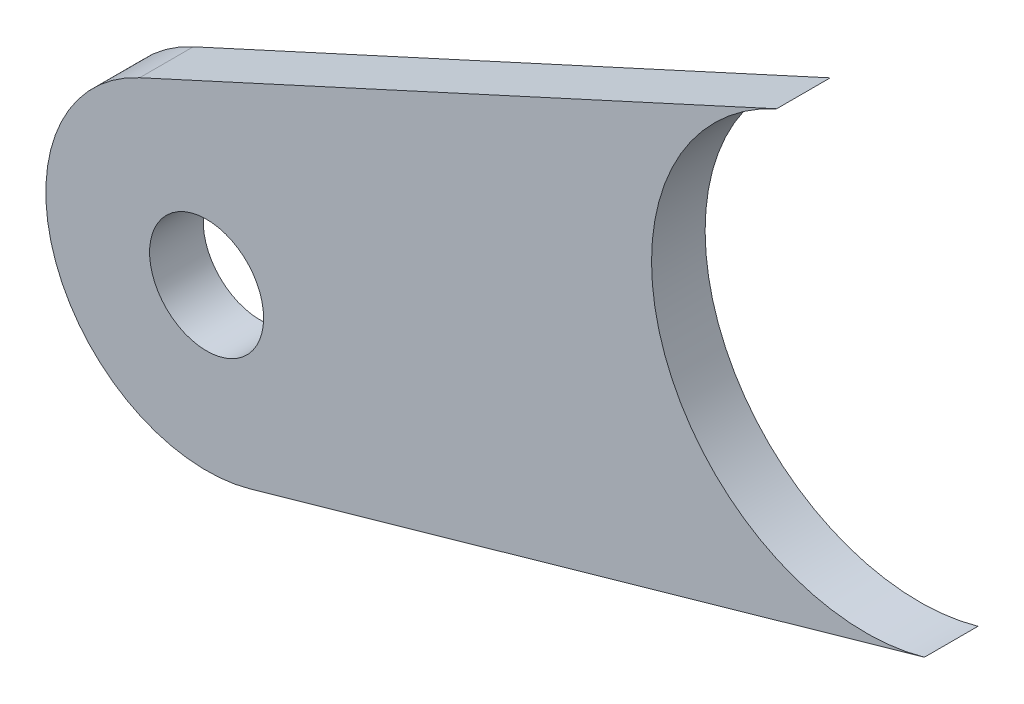
ISO-10303-21;
HEADER;
FILE_DESCRIPTION(('STEP AP214'),'2;1');
FILE_NAME('part.step','',(''),(''),'','','');
FILE_SCHEMA(('AUTOMOTIVE_DESIGN { 1 0 10303 214 1 1 1 1 }'));
ENDSEC;
DATA;
#1=APPLICATION_CONTEXT('core data for automotive mechanical design processes');
#2=APPLICATION_PROTOCOL_DEFINITION('international standard','automotive_design',2000,#1);
#3=PRODUCT_CONTEXT('',#1,'mechanical');
#4=PRODUCT('Part','Part','',(#3));
#5=PRODUCT_RELATED_PRODUCT_CATEGORY('part','',(#4));
#6=PRODUCT_DEFINITION_FORMATION('','',#4);
#7=PRODUCT_DEFINITION_CONTEXT('part definition',#1,'design');
#8=PRODUCT_DEFINITION('design','',#6,#7);
#9=PRODUCT_DEFINITION_SHAPE('','',#8);
#10=(LENGTH_UNIT() NAMED_UNIT(*) SI_UNIT(.MILLI.,.METRE.));
#11=(NAMED_UNIT(*) PLANE_ANGLE_UNIT() SI_UNIT($,.RADIAN.));
#12=(NAMED_UNIT(*) SI_UNIT($,.STERADIAN.) SOLID_ANGLE_UNIT());
#13=UNCERTAINTY_MEASURE_WITH_UNIT(LENGTH_MEASURE(1.E-05),#10,'distance_accuracy_value','');
#14=(GEOMETRIC_REPRESENTATION_CONTEXT(3) GLOBAL_UNCERTAINTY_ASSIGNED_CONTEXT((#13)) GLOBAL_UNIT_ASSIGNED_CONTEXT((#10,
#11,#12)) REPRESENTATION_CONTEXT('',''));
#15=CARTESIAN_POINT('',(0.,0.,0.));
#16=DIRECTION('',(0.,0.,1.));
#17=DIRECTION('',(1.,0.,0.));
#18=AXIS2_PLACEMENT_3D('',#15,#16,#17);
#19=CARTESIAN_POINT('',(13.6307809818761,-29.7770692260945,3.175));
#20=DIRECTION('',(-0.416224605095547,0.909261831439688,0.));
#21=DIRECTION('',(-0.909261831439688,-0.416224605095547,0.));
#22=AXIS2_PLACEMENT_3D('',#19,#20,#21);
#23=PLANE('',#22);
#24=DIRECTION('',(0.909261831439689,0.416224605095547,0.));
#25=VECTOR('',#24,1.);
#26=CARTESIAN_POINT('',(13.6307809818761,-29.7770692260945,0.));
#27=LINE('',#26,#25);
#28=CARTESIAN_POINT('',(97.5999006364649,8.66071894446303,0.));
#29=VERTEX_POINT('',#28);
#30=CARTESIAN_POINT('',(135.340894537363,25.9370740482972,0.));
#31=VERTEX_POINT('',#30);
#32=EDGE_CURVE('E108',#29,#31,#27,.T.);
#33=ORIENTED_EDGE('',*,*,#32,.F.);
#34=DIRECTION('',(0.,0.,-1.));
#35=VECTOR('',#34,1.);
#36=CARTESIAN_POINT('',(97.5999006364649,8.66071894446303,3.175));
#37=LINE('',#36,#35);
#38=CARTESIAN_POINT('',(97.5999006364649,8.66071894446303,3.175));
#39=VERTEX_POINT('',#38);
#40=EDGE_CURVE('E11',#39,#29,#37,.T.);
#41=ORIENTED_EDGE('',*,*,#40,.F.);
#42=DIRECTION('',(0.909261831439689,0.416224605095547,0.));
#43=VECTOR('',#42,1.);
#44=CARTESIAN_POINT('',(13.6307809818761,-29.7770692260945,3.175));
#45=LINE('',#44,#43);
#46=CARTESIAN_POINT('',(135.340894537363,25.9370740482972,3.175));
#47=VERTEX_POINT('',#46);
#48=EDGE_CURVE('E90',#39,#47,#45,.T.);
#49=ORIENTED_EDGE('',*,*,#48,.T.);
#50=DIRECTION('',(0.,0.,-1.));
#51=VECTOR('',#50,1.);
#52=CARTESIAN_POINT('',(135.340894537363,25.9370740482972,3.175));
#53=LINE('',#52,#51);
#54=EDGE_CURVE('E57',#47,#31,#53,.T.);
#55=ORIENTED_EDGE('',*,*,#54,.T.);
#56=EDGE_LOOP('',(#33,#41,#49,#55));
#57=FACE_BOUND('',#56,.T.);
#58=ADVANCED_FACE('F41',(#57),#23,.T.);
#59=CARTESIAN_POINT('',(101.56444,0.,3.175));
#60=DIRECTION('',(0.,0.,-1.));
#61=DIRECTION('',(-1.,0.,0.));
#62=AXIS2_PLACEMENT_3D('',#59,#60,#61);
#63=CYLINDRICAL_SURFACE('',#62,9.52500000000001);
#64=CARTESIAN_POINT('',(101.56444,0.,0.));
#65=DIRECTION('',(0.,0.,1.));
#66=DIRECTION('',(1.,0.,0.));
#67=AXIS2_PLACEMENT_3D('',#64,#65,#66);
#68=CIRCLE('',#67,9.52500000000001);
#69=CARTESIAN_POINT('',(104.16560106799,-9.16294636557346,0.));
#70=VERTEX_POINT('',#69);
#71=EDGE_CURVE('E96',#29,#70,#68,.T.);
#72=ORIENTED_EDGE('',*,*,#71,.T.);
#73=DIRECTION('',(0.,0.,-1.));
#74=VECTOR('',#73,1.);
#75=CARTESIAN_POINT('',(104.16560106799,-9.16294636557346,3.175));
#76=LINE('',#75,#74);
#77=CARTESIAN_POINT('',(104.16560106799,-9.16294636557346,3.175));
#78=VERTEX_POINT('',#77);
#79=EDGE_CURVE('E49',#78,#70,#76,.T.);
#80=ORIENTED_EDGE('',*,*,#79,.F.);
#81=CARTESIAN_POINT('',(101.56444,0.,3.175));
#82=DIRECTION('',(0.,0.,1.));
#83=DIRECTION('',(1.,0.,0.));
#84=AXIS2_PLACEMENT_3D('',#81,#82,#83);
#85=CIRCLE('',#84,9.52500000000001);
#86=EDGE_CURVE('E83',#39,#78,#85,.T.);
#87=ORIENTED_EDGE('',*,*,#86,.F.);
#88=ORIENTED_EDGE('',*,*,#40,.T.);
#89=EDGE_LOOP('',(#72,#80,#87,#88));
#90=FACE_BOUND('',#89,.T.);
#91=ADVANCED_FACE('F94',(#90),#63,.T.);
#92=CARTESIAN_POINT('',(10.1755255549988,-35.8446833798106,3.175));
#93=DIRECTION('',(-0.273087776166883,0.961989119745242,0.));
#94=DIRECTION('',(-0.961989119745243,-0.273087776166883,0.));
#95=AXIS2_PLACEMENT_3D('',#92,#93,#94);
#96=PLANE('',#95);
#97=DIRECTION('',(0.961989119745242,0.273087776166883,0.));
#98=VECTOR('',#97,1.);
#99=CARTESIAN_POINT('',(10.1755255549988,-35.8446833798106,0.));
#100=LINE('',#99,#98);
#101=CARTESIAN_POINT('',(144.095161779396,2.17218696824859,0.));
#102=VERTEX_POINT('',#101);
#103=EDGE_CURVE('E111',#70,#102,#100,.T.);
#104=ORIENTED_EDGE('',*,*,#103,.T.);
#105=DIRECTION('',(0.,0.,-1.));
#106=VECTOR('',#105,1.);
#107=CARTESIAN_POINT('',(144.095161779396,2.17218696824859,3.175));
#108=LINE('',#107,#106);
#109=CARTESIAN_POINT('',(144.095161779396,2.17218696824859,3.175));
#110=VERTEX_POINT('',#109);
#111=EDGE_CURVE('E71',#110,#102,#108,.T.);
#112=ORIENTED_EDGE('',*,*,#111,.F.);
#113=DIRECTION('',(0.961989119745242,0.273087776166883,0.));
#114=VECTOR('',#113,1.);
#115=CARTESIAN_POINT('',(10.1755255549988,-35.8446833798106,3.175));
#116=LINE('',#115,#114);
#117=EDGE_CURVE('E89',#78,#110,#116,.T.);
#118=ORIENTED_EDGE('',*,*,#117,.F.);
#119=ORIENTED_EDGE('',*,*,#79,.T.);
#120=EDGE_LOOP('',(#104,#112,#118,#119));
#121=FACE_BOUND('',#120,.T.);
#122=ADVANCED_FACE('F99',(#121),#96,.F.);
#123=CARTESIAN_POINT('',(140.626947022076,14.3894487890132,3.175));
#124=DIRECTION('',(0.,0.,-1.));
#125=DIRECTION('',(-1.,0.,0.));
#126=AXIS2_PLACEMENT_3D('',#123,#124,#125);
#127=CYLINDRICAL_SURFACE('',#126,12.7);
#128=CARTESIAN_POINT('',(140.626947022076,14.3894487890132,0.));
#129=DIRECTION('',(0.,0.,1.));
#130=DIRECTION('',(1.,0.,0.));
#131=AXIS2_PLACEMENT_3D('',#128,#129,#130);
#132=CIRCLE('',#131,12.7);
#133=EDGE_CURVE('E113',#31,#102,#132,.T.);
#134=ORIENTED_EDGE('',*,*,#133,.F.);
#135=ORIENTED_EDGE('',*,*,#54,.F.);
#136=CARTESIAN_POINT('',(140.626947022076,14.3894487890132,3.175));
#137=DIRECTION('',(0.,0.,1.));
#138=DIRECTION('',(1.,0.,0.));
#139=AXIS2_PLACEMENT_3D('',#136,#137,#138);
#140=CIRCLE('',#139,12.7);
#141=EDGE_CURVE('E100',#47,#110,#140,.T.);
#142=ORIENTED_EDGE('',*,*,#141,.T.);
#143=ORIENTED_EDGE('',*,*,#111,.T.);
#144=EDGE_LOOP('',(#134,#135,#142,#143));
#145=FACE_BOUND('',#144,.T.);
#146=ADVANCED_FACE('F122',(#145),#127,.F.);
#147=CARTESIAN_POINT('',(101.56444,0.,3.175));
#148=DIRECTION('',(0.,0.,-1.));
#149=DIRECTION('',(-1.,0.,0.));
#150=AXIS2_PLACEMENT_3D('',#147,#148,#149);
#151=CYLINDRICAL_SURFACE('',#150,3.37819999999999);
#152=CARTESIAN_POINT('',(101.56444,0.,3.175));
#153=DIRECTION('',(0.,0.,1.));
#154=DIRECTION('',(1.,0.,0.));
#155=AXIS2_PLACEMENT_3D('',#152,#153,#154);
#156=CIRCLE('',#155,3.37819999999999);
#157=CARTESIAN_POINT('',(104.94264,0.,3.175));
#158=VERTEX_POINT('',#157);
#159=EDGE_CURVE('E102',#158,#158,#156,.F.);
#160=ORIENTED_EDGE('',*,*,#159,.F.);
#161=EDGE_LOOP('',(#160));
#162=FACE_BOUND('',#161,.T.);
#163=CARTESIAN_POINT('',(101.56444,0.,0.));
#164=DIRECTION('',(0.,0.,1.));
#165=DIRECTION('',(1.,0.,0.));
#166=AXIS2_PLACEMENT_3D('',#163,#164,#165);
#167=CIRCLE('',#166,3.37819999999999);
#168=CARTESIAN_POINT('',(104.94264,0.,0.));
#169=VERTEX_POINT('',#168);
#170=EDGE_CURVE('E116',#169,#169,#167,.F.);
#171=ORIENTED_EDGE('',*,*,#170,.T.);
#172=EDGE_LOOP('',(#171));
#173=FACE_BOUND('',#172,.T.);
#174=ADVANCED_FACE('F124',(#162,#173),#151,.F.);
#175=CARTESIAN_POINT('',(0.,0.,3.175));
#176=DIRECTION('',(0.,0.,1.));
#177=DIRECTION('',(1.,0.,0.));
#178=AXIS2_PLACEMENT_3D('',#175,#176,#177);
#179=PLANE('',#178);
#180=ORIENTED_EDGE('',*,*,#48,.F.);
#181=ORIENTED_EDGE('',*,*,#86,.T.);
#182=ORIENTED_EDGE('',*,*,#117,.T.);
#183=ORIENTED_EDGE('',*,*,#141,.F.);
#184=EDGE_LOOP('',(#180,#181,#182,#183));
#185=FACE_BOUND('',#184,.T.);
#186=ORIENTED_EDGE('',*,*,#159,.T.);
#187=EDGE_LOOP('',(#186));
#188=FACE_BOUND('',#187,.T.);
#189=ADVANCED_FACE('F85',(#185,#188),#179,.T.);
#190=CARTESIAN_POINT('',(0.,0.,0.));
#191=DIRECTION('',(0.,0.,1.));
#192=DIRECTION('',(1.,0.,0.));
#193=AXIS2_PLACEMENT_3D('',#190,#191,#192);
#194=PLANE('',#193);
#195=ORIENTED_EDGE('',*,*,#32,.T.);
#196=ORIENTED_EDGE('',*,*,#133,.T.);
#197=ORIENTED_EDGE('',*,*,#103,.F.);
#198=ORIENTED_EDGE('',*,*,#71,.F.);
#199=EDGE_LOOP('',(#195,#196,#197,#198));
#200=FACE_BOUND('',#199,.T.);
#201=ORIENTED_EDGE('',*,*,#170,.F.);
#202=EDGE_LOOP('',(#201));
#203=FACE_BOUND('',#202,.T.);
#204=ADVANCED_FACE('F168',(#200,#203),#194,.F.);
#205=CLOSED_SHELL('',(#58,#91,#122,#146,#174,#189,#204));
#206=MANIFOLD_SOLID_BREP('B2',#205);
#207=ADVANCED_BREP_SHAPE_REPRESENTATION('',(#18,#206),#14);
#208=SHAPE_DEFINITION_REPRESENTATION(#9,#207);
ENDSEC;
END-ISO-10303-21;
